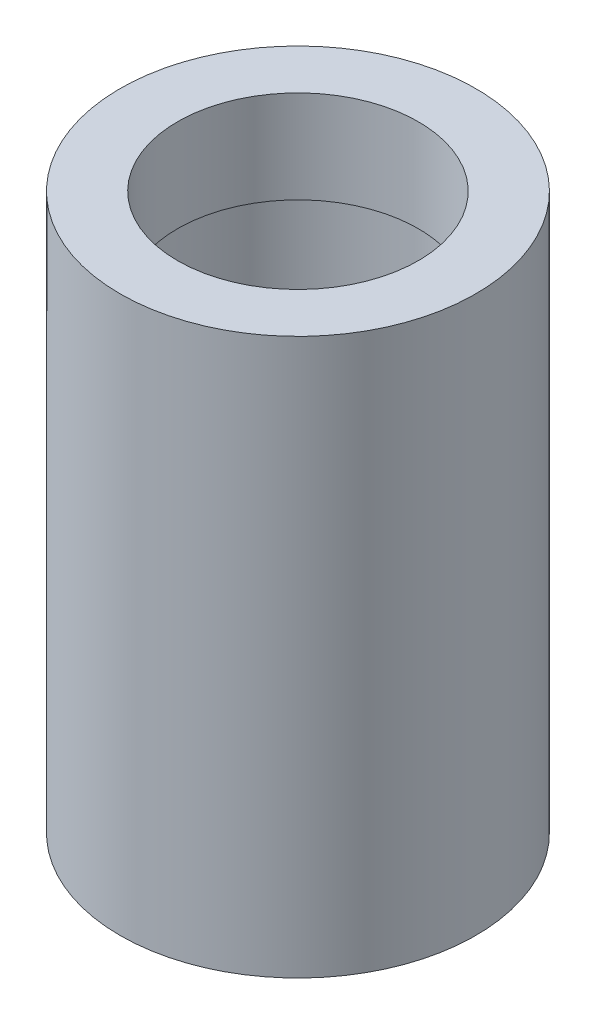
ISO-10303-21;
HEADER;
FILE_DESCRIPTION(('STEP AP214'),'2;1');
FILE_NAME('part.step','',(''),(''),'','','');
FILE_SCHEMA(('AUTOMOTIVE_DESIGN { 1 0 10303 214 1 1 1 1 }'));
ENDSEC;
DATA;
#1=APPLICATION_CONTEXT('core data for automotive mechanical design processes');
#2=APPLICATION_PROTOCOL_DEFINITION('international standard','automotive_design',2000,#1);
#3=PRODUCT_CONTEXT('',#1,'mechanical');
#4=PRODUCT('Part','Part','',(#3));
#5=PRODUCT_RELATED_PRODUCT_CATEGORY('part','',(#4));
#6=PRODUCT_DEFINITION_FORMATION('','',#4);
#7=PRODUCT_DEFINITION_CONTEXT('part definition',#1,'design');
#8=PRODUCT_DEFINITION('design','',#6,#7);
#9=PRODUCT_DEFINITION_SHAPE('','',#8);
#10=(LENGTH_UNIT() NAMED_UNIT(*) SI_UNIT(.MILLI.,.METRE.));
#11=(NAMED_UNIT(*) PLANE_ANGLE_UNIT() SI_UNIT($,.RADIAN.));
#12=(NAMED_UNIT(*) SI_UNIT($,.STERADIAN.) SOLID_ANGLE_UNIT());
#13=UNCERTAINTY_MEASURE_WITH_UNIT(LENGTH_MEASURE(1.E-05),#10,'distance_accuracy_value','');
#14=(GEOMETRIC_REPRESENTATION_CONTEXT(3) GLOBAL_UNCERTAINTY_ASSIGNED_CONTEXT((#13)) GLOBAL_UNIT_ASSIGNED_CONTEXT((#10,
#11,#12)) REPRESENTATION_CONTEXT('',''));
#15=CARTESIAN_POINT('',(0.,0.,0.));
#16=DIRECTION('',(0.,0.,1.));
#17=DIRECTION('',(1.,0.,0.));
#18=AXIS2_PLACEMENT_3D('',#15,#16,#17);
#19=CARTESIAN_POINT('',(0.,15.,0.));
#20=DIRECTION('',(0.,-1.,0.));
#21=DIRECTION('',(0.,0.,-1.));
#22=AXIS2_PLACEMENT_3D('',#19,#20,#21);
#23=CYLINDRICAL_SURFACE('',#22,3.5);
#24=CARTESIAN_POINT('',(0.,0.3,0.));
#25=DIRECTION('',(0.,1.,0.));
#26=DIRECTION('',(0.,0.,1.));
#27=AXIS2_PLACEMENT_3D('',#24,#25,#26);
#28=CIRCLE('',#27,3.5);
#29=CARTESIAN_POINT('',(0.,0.3,3.5));
#30=VERTEX_POINT('',#29);
#31=EDGE_CURVE('E10',#30,#30,#28,.F.);
#32=ORIENTED_EDGE('',*,*,#31,.T.);
#33=EDGE_LOOP('',(#32));
#34=FACE_BOUND('',#33,.T.);
#35=CARTESIAN_POINT('',(0.,12.5,0.));
#36=DIRECTION('',(0.,1.,0.));
#37=DIRECTION('',(0.,0.,1.));
#38=AXIS2_PLACEMENT_3D('',#35,#36,#37);
#39=CIRCLE('',#38,3.5);
#40=CARTESIAN_POINT('',(0.,12.5,3.5));
#41=VERTEX_POINT('',#40);
#42=EDGE_CURVE('E54',#41,#41,#39,.T.);
#43=ORIENTED_EDGE('',*,*,#42,.T.);
#44=EDGE_LOOP('',(#43));
#45=FACE_BOUND('',#44,.T.);
#46=ADVANCED_FACE('F40',(#34,#45),#23,.F.);
#47=CARTESIAN_POINT('',(0.,15.,0.));
#48=DIRECTION('',(0.,1.,0.));
#49=DIRECTION('',(0.,0.,1.));
#50=AXIS2_PLACEMENT_3D('',#47,#48,#49);
#51=PLANE('',#50);
#52=CARTESIAN_POINT('',(0.,15.,0.));
#53=DIRECTION('',(0.,1.,0.));
#54=DIRECTION('',(0.,0.,1.));
#55=AXIS2_PLACEMENT_3D('',#52,#53,#54);
#56=CIRCLE('',#55,4.8);
#57=CARTESIAN_POINT('',(0.,15.,4.8));
#58=VERTEX_POINT('',#57);
#59=EDGE_CURVE('E48',#58,#58,#56,.T.);
#60=ORIENTED_EDGE('',*,*,#59,.T.);
#61=EDGE_LOOP('',(#60));
#62=FACE_BOUND('',#61,.T.);
#63=CARTESIAN_POINT('',(0.,15.,0.));
#64=DIRECTION('',(0.,1.,0.));
#65=DIRECTION('',(0.,0.,1.));
#66=AXIS2_PLACEMENT_3D('',#63,#64,#65);
#67=CIRCLE('',#66,3.25);
#68=CARTESIAN_POINT('',(0.,15.,3.25));
#69=VERTEX_POINT('',#68);
#70=EDGE_CURVE('E62',#69,#69,#67,.T.);
#71=ORIENTED_EDGE('',*,*,#70,.F.);
#72=EDGE_LOOP('',(#71));
#73=FACE_BOUND('',#72,.T.);
#74=ADVANCED_FACE('F77',(#62,#73),#51,.T.);
#75=CARTESIAN_POINT('',(0.,0.,0.));
#76=DIRECTION('',(0.,1.,0.));
#77=DIRECTION('',(0.,0.,1.));
#78=AXIS2_PLACEMENT_3D('',#75,#76,#77);
#79=PLANE('',#78);
#80=CARTESIAN_POINT('',(0.,0.,0.));
#81=DIRECTION('',(0.,1.,0.));
#82=DIRECTION('',(0.,0.,1.));
#83=AXIS2_PLACEMENT_3D('',#80,#81,#82);
#84=CIRCLE('',#83,3.8);
#85=CARTESIAN_POINT('',(0.,0.,3.8));
#86=VERTEX_POINT('',#85);
#87=EDGE_CURVE('E42',#86,#86,#84,.T.);
#88=ORIENTED_EDGE('',*,*,#87,.T.);
#89=EDGE_LOOP('',(#88));
#90=FACE_BOUND('',#89,.T.);
#91=CARTESIAN_POINT('',(0.,0.,0.));
#92=DIRECTION('',(0.,1.,0.));
#93=DIRECTION('',(0.,0.,1.));
#94=AXIS2_PLACEMENT_3D('',#91,#92,#93);
#95=CIRCLE('',#94,4.8);
#96=CARTESIAN_POINT('',(0.,0.,4.8));
#97=VERTEX_POINT('',#96);
#98=EDGE_CURVE('E55',#97,#97,#95,.T.);
#99=ORIENTED_EDGE('',*,*,#98,.F.);
#100=EDGE_LOOP('',(#99));
#101=FACE_BOUND('',#100,.T.);
#102=ADVANCED_FACE('F79',(#90,#101),#79,.F.);
#103=CARTESIAN_POINT('',(0.,15.,0.));
#104=DIRECTION('',(0.,-1.,0.));
#105=DIRECTION('',(0.,0.,-1.));
#106=AXIS2_PLACEMENT_3D('',#103,#104,#105);
#107=CYLINDRICAL_SURFACE('',#106,4.8);
#108=ORIENTED_EDGE('',*,*,#59,.F.);
#109=EDGE_LOOP('',(#108));
#110=FACE_BOUND('',#109,.T.);
#111=ORIENTED_EDGE('',*,*,#98,.T.);
#112=EDGE_LOOP('',(#111));
#113=FACE_BOUND('',#112,.T.);
#114=ADVANCED_FACE('F88',(#110,#113),#107,.T.);
#115=CARTESIAN_POINT('',(0.,12.5,0.));
#116=DIRECTION('',(0.,1.,0.));
#117=DIRECTION('',(0.,0.,1.));
#118=AXIS2_PLACEMENT_3D('',#115,#116,#117);
#119=PLANE('',#118);
#120=CARTESIAN_POINT('',(0.,12.5,0.));
#121=DIRECTION('',(0.,1.,0.));
#122=DIRECTION('',(0.,0.,1.));
#123=AXIS2_PLACEMENT_3D('',#120,#121,#122);
#124=CIRCLE('',#123,3.25);
#125=CARTESIAN_POINT('',(0.,12.5,3.25));
#126=VERTEX_POINT('',#125);
#127=EDGE_CURVE('E59',#126,#126,#124,.T.);
#128=ORIENTED_EDGE('',*,*,#127,.T.);
#129=EDGE_LOOP('',(#128));
#130=FACE_BOUND('',#129,.T.);
#131=ORIENTED_EDGE('',*,*,#42,.F.);
#132=EDGE_LOOP('',(#131));
#133=FACE_BOUND('',#132,.T.);
#134=ADVANCED_FACE('F70',(#130,#133),#119,.F.);
#135=CARTESIAN_POINT('',(0.,12.5,0.));
#136=DIRECTION('',(0.,1.,0.));
#137=DIRECTION('',(0.,0.,1.));
#138=AXIS2_PLACEMENT_3D('',#135,#136,#137);
#139=CYLINDRICAL_SURFACE('',#138,3.25);
#140=ORIENTED_EDGE('',*,*,#127,.F.);
#141=EDGE_LOOP('',(#140));
#142=FACE_BOUND('',#141,.T.);
#143=ORIENTED_EDGE('',*,*,#70,.T.);
#144=EDGE_LOOP('',(#143));
#145=FACE_BOUND('',#144,.T.);
#146=ADVANCED_FACE('F67',(#142,#145),#139,.F.);
#147=CARTESIAN_POINT('',(0.,0.3,0.));
#148=DIRECTION('',(0.,1.,0.));
#149=DIRECTION('',(0.,0.,1.));
#150=AXIS2_PLACEMENT_3D('',#147,#148,#149);
#151=TOROIDAL_SURFACE('',#150,3.8,0.3);
#152=ORIENTED_EDGE('',*,*,#31,.F.);
#153=EDGE_LOOP('',(#152));
#154=FACE_BOUND('',#153,.T.);
#155=ORIENTED_EDGE('',*,*,#87,.F.);
#156=EDGE_LOOP('',(#155));
#157=FACE_BOUND('',#156,.T.);
#158=ADVANCED_FACE('F39',(#154,#157),#151,.T.);
#159=CLOSED_SHELL('',(#46,#74,#102,#114,#134,#146,#158));
#160=MANIFOLD_SOLID_BREP('B2',#159);
#161=ADVANCED_BREP_SHAPE_REPRESENTATION('',(#18,#160),#14);
#162=SHAPE_DEFINITION_REPRESENTATION(#9,#161);
ENDSEC;
END-ISO-10303-21;
